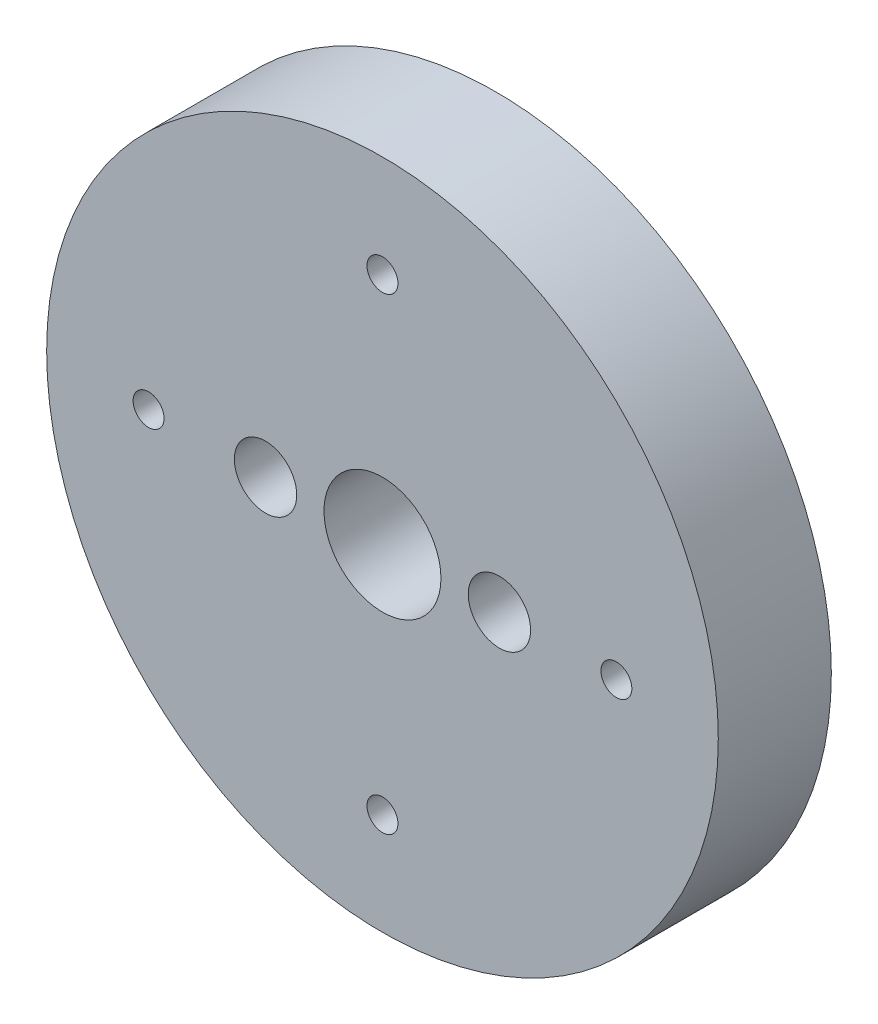
ISO-10303-21;
HEADER;
FILE_DESCRIPTION(('STEP AP214'),'2;1');
FILE_NAME('part.step','',(''),(''),'','','');
FILE_SCHEMA(('AUTOMOTIVE_DESIGN { 1 0 10303 214 1 1 1 1 }'));
ENDSEC;
DATA;
#1=APPLICATION_CONTEXT('core data for automotive mechanical design processes');
#2=APPLICATION_PROTOCOL_DEFINITION('international standard','automotive_design',2000,#1);
#3=PRODUCT_CONTEXT('',#1,'mechanical');
#4=PRODUCT('Part','Part','',(#3));
#5=PRODUCT_RELATED_PRODUCT_CATEGORY('part','',(#4));
#6=PRODUCT_DEFINITION_FORMATION('','',#4);
#7=PRODUCT_DEFINITION_CONTEXT('part definition',#1,'design');
#8=PRODUCT_DEFINITION('design','',#6,#7);
#9=PRODUCT_DEFINITION_SHAPE('','',#8);
#10=(LENGTH_UNIT() NAMED_UNIT(*) SI_UNIT(.MILLI.,.METRE.));
#11=(NAMED_UNIT(*) PLANE_ANGLE_UNIT() SI_UNIT($,.RADIAN.));
#12=(NAMED_UNIT(*) SI_UNIT($,.STERADIAN.) SOLID_ANGLE_UNIT());
#13=UNCERTAINTY_MEASURE_WITH_UNIT(LENGTH_MEASURE(1.E-05),#10,'distance_accuracy_value','');
#14=(GEOMETRIC_REPRESENTATION_CONTEXT(3) GLOBAL_UNCERTAINTY_ASSIGNED_CONTEXT((#13)) GLOBAL_UNIT_ASSIGNED_CONTEXT((#10,
#11,#12)) REPRESENTATION_CONTEXT('',''));
#15=CARTESIAN_POINT('',(0.,0.,0.));
#16=DIRECTION('',(0.,0.,1.));
#17=DIRECTION('',(1.,0.,0.));
#18=AXIS2_PLACEMENT_3D('',#15,#16,#17);
#19=CARTESIAN_POINT('',(0.,0.,5.8));
#20=DIRECTION('',(0.,0.,1.));
#21=DIRECTION('',(1.,0.,0.));
#22=AXIS2_PLACEMENT_3D('',#19,#20,#21);
#23=PLANE('',#22);
#24=CARTESIAN_POINT('',(-6.,0.,5.8));
#25=DIRECTION('',(0.,0.,1.));
#26=DIRECTION('',(1.,0.,0.));
#27=AXIS2_PLACEMENT_3D('',#24,#25,#26);
#28=CIRCLE('',#27,1.59999999999999);
#29=CARTESIAN_POINT('',(-4.40000000000001,0.,5.8));
#30=VERTEX_POINT('',#29);
#31=EDGE_CURVE('E63',#30,#30,#28,.T.);
#32=ORIENTED_EDGE('',*,*,#31,.F.);
#33=EDGE_LOOP('',(#32));
#34=FACE_BOUND('',#33,.T.);
#35=CARTESIAN_POINT('',(6.,0.,5.8));
#36=DIRECTION('',(0.,0.,1.));
#37=DIRECTION('',(1.,0.,0.));
#38=AXIS2_PLACEMENT_3D('',#35,#36,#37);
#39=CIRCLE('',#38,1.59999999999999);
#40=CARTESIAN_POINT('',(7.59999999999999,0.,5.8));
#41=VERTEX_POINT('',#40);
#42=EDGE_CURVE('E52',#41,#41,#39,.T.);
#43=ORIENTED_EDGE('',*,*,#42,.F.);
#44=EDGE_LOOP('',(#43));
#45=FACE_BOUND('',#44,.T.);
#46=CARTESIAN_POINT('',(-12.,0.,5.8));
#47=DIRECTION('',(0.,0.,1.));
#48=DIRECTION('',(1.,0.,0.));
#49=AXIS2_PLACEMENT_3D('',#46,#47,#48);
#50=CIRCLE('',#49,0.793749999999999);
#51=CARTESIAN_POINT('',(-11.20625,0.,5.8));
#52=VERTEX_POINT('',#51);
#53=EDGE_CURVE('E51',#52,#52,#50,.T.);
#54=ORIENTED_EDGE('',*,*,#53,.F.);
#55=EDGE_LOOP('',(#54));
#56=FACE_BOUND('',#55,.T.);
#57=CARTESIAN_POINT('',(0.,-12.,5.8));
#58=DIRECTION('',(0.,0.,1.));
#59=DIRECTION('',(1.,0.,0.));
#60=AXIS2_PLACEMENT_3D('',#57,#58,#59);
#61=CIRCLE('',#60,0.793749999999999);
#62=CARTESIAN_POINT('',(0.793750000000001,-12.,5.8));
#63=VERTEX_POINT('',#62);
#64=EDGE_CURVE('E67',#63,#63,#61,.T.);
#65=ORIENTED_EDGE('',*,*,#64,.F.);
#66=EDGE_LOOP('',(#65));
#67=FACE_BOUND('',#66,.T.);
#68=CARTESIAN_POINT('',(12.,0.,5.8));
#69=DIRECTION('',(0.,0.,1.));
#70=DIRECTION('',(1.,0.,0.));
#71=AXIS2_PLACEMENT_3D('',#68,#69,#70);
#72=CIRCLE('',#71,0.793749999999999);
#73=CARTESIAN_POINT('',(12.79375,0.,5.8));
#74=VERTEX_POINT('',#73);
#75=EDGE_CURVE('E72',#74,#74,#72,.T.);
#76=ORIENTED_EDGE('',*,*,#75,.F.);
#77=EDGE_LOOP('',(#76));
#78=FACE_BOUND('',#77,.T.);
#79=CARTESIAN_POINT('',(0.,12.,5.8));
#80=DIRECTION('',(0.,0.,1.));
#81=DIRECTION('',(1.,0.,0.));
#82=AXIS2_PLACEMENT_3D('',#79,#80,#81);
#83=CIRCLE('',#82,0.79375);
#84=CARTESIAN_POINT('',(0.79375,12.,5.8));
#85=VERTEX_POINT('',#84);
#86=EDGE_CURVE('E78',#85,#85,#83,.T.);
#87=ORIENTED_EDGE('',*,*,#86,.F.);
#88=EDGE_LOOP('',(#87));
#89=FACE_BOUND('',#88,.T.);
#90=CARTESIAN_POINT('',(0.,0.,5.8));
#91=DIRECTION('',(0.,0.,1.));
#92=DIRECTION('',(1.,0.,0.));
#93=AXIS2_PLACEMENT_3D('',#90,#91,#92);
#94=CIRCLE('',#93,17.2291666666667);
#95=CARTESIAN_POINT('',(17.2291666666667,0.,5.8));
#96=VERTEX_POINT('',#95);
#97=EDGE_CURVE('E10',#96,#96,#94,.T.);
#98=ORIENTED_EDGE('',*,*,#97,.T.);
#99=EDGE_LOOP('',(#98));
#100=FACE_BOUND('',#99,.T.);
#101=CARTESIAN_POINT('',(0.,0.,5.8));
#102=DIRECTION('',(0.,0.,1.));
#103=DIRECTION('',(1.,0.,0.));
#104=AXIS2_PLACEMENT_3D('',#101,#102,#103);
#105=CIRCLE('',#104,3.);
#106=CARTESIAN_POINT('',(3.,0.,5.8));
#107=VERTEX_POINT('',#106);
#108=EDGE_CURVE('E44',#107,#107,#105,.T.);
#109=ORIENTED_EDGE('',*,*,#108,.F.);
#110=EDGE_LOOP('',(#109));
#111=FACE_BOUND('',#110,.T.);
#112=ADVANCED_FACE('F31',(#34,#45,#56,#67,#78,#89,#100,#111),#23,.T.);
#113=CARTESIAN_POINT('',(0.,0.,0.));
#114=DIRECTION('',(0.,0.,1.));
#115=DIRECTION('',(1.,0.,0.));
#116=AXIS2_PLACEMENT_3D('',#113,#114,#115);
#117=PLANE('',#116);
#118=CARTESIAN_POINT('',(-6.,0.,0.));
#119=DIRECTION('',(0.,0.,1.));
#120=DIRECTION('',(1.,0.,0.));
#121=AXIS2_PLACEMENT_3D('',#118,#119,#120);
#122=CIRCLE('',#121,1.59999999999999);
#123=CARTESIAN_POINT('',(-4.40000000000001,0.,0.));
#124=VERTEX_POINT('',#123);
#125=EDGE_CURVE('E35',#124,#124,#122,.T.);
#126=ORIENTED_EDGE('',*,*,#125,.T.);
#127=EDGE_LOOP('',(#126));
#128=FACE_BOUND('',#127,.T.);
#129=CARTESIAN_POINT('',(6.,0.,0.));
#130=DIRECTION('',(0.,0.,1.));
#131=DIRECTION('',(1.,0.,0.));
#132=AXIS2_PLACEMENT_3D('',#129,#130,#131);
#133=CIRCLE('',#132,1.59999999999999);
#134=CARTESIAN_POINT('',(7.59999999999999,0.,0.));
#135=VERTEX_POINT('',#134);
#136=EDGE_CURVE('E49',#135,#135,#133,.T.);
#137=ORIENTED_EDGE('',*,*,#136,.T.);
#138=EDGE_LOOP('',(#137));
#139=FACE_BOUND('',#138,.T.);
#140=CARTESIAN_POINT('',(-12.,0.,0.));
#141=DIRECTION('',(0.,0.,1.));
#142=DIRECTION('',(1.,0.,0.));
#143=AXIS2_PLACEMENT_3D('',#140,#141,#142);
#144=CIRCLE('',#143,0.793749999999999);
#145=CARTESIAN_POINT('',(-11.20625,0.,0.));
#146=VERTEX_POINT('',#145);
#147=EDGE_CURVE('E56',#146,#146,#144,.T.);
#148=ORIENTED_EDGE('',*,*,#147,.T.);
#149=EDGE_LOOP('',(#148));
#150=FACE_BOUND('',#149,.T.);
#151=CARTESIAN_POINT('',(0.,-12.,0.));
#152=DIRECTION('',(0.,0.,1.));
#153=DIRECTION('',(1.,0.,0.));
#154=AXIS2_PLACEMENT_3D('',#151,#152,#153);
#155=CIRCLE('',#154,0.793749999999999);
#156=CARTESIAN_POINT('',(0.793750000000001,-12.,0.));
#157=VERTEX_POINT('',#156);
#158=EDGE_CURVE('E69',#157,#157,#155,.T.);
#159=ORIENTED_EDGE('',*,*,#158,.T.);
#160=EDGE_LOOP('',(#159));
#161=FACE_BOUND('',#160,.T.);
#162=CARTESIAN_POINT('',(12.,0.,0.));
#163=DIRECTION('',(0.,0.,1.));
#164=DIRECTION('',(1.,0.,0.));
#165=AXIS2_PLACEMENT_3D('',#162,#163,#164);
#166=CIRCLE('',#165,0.793749999999999);
#167=CARTESIAN_POINT('',(12.79375,0.,0.));
#168=VERTEX_POINT('',#167);
#169=EDGE_CURVE('E75',#168,#168,#166,.T.);
#170=ORIENTED_EDGE('',*,*,#169,.T.);
#171=EDGE_LOOP('',(#170));
#172=FACE_BOUND('',#171,.T.);
#173=CARTESIAN_POINT('',(0.,12.,0.));
#174=DIRECTION('',(0.,0.,1.));
#175=DIRECTION('',(1.,0.,0.));
#176=AXIS2_PLACEMENT_3D('',#173,#174,#175);
#177=CIRCLE('',#176,0.79375);
#178=CARTESIAN_POINT('',(0.79375,12.,0.));
#179=VERTEX_POINT('',#178);
#180=EDGE_CURVE('E81',#179,#179,#177,.T.);
#181=ORIENTED_EDGE('',*,*,#180,.T.);
#182=EDGE_LOOP('',(#181));
#183=FACE_BOUND('',#182,.T.);
#184=CARTESIAN_POINT('',(0.,0.,0.));
#185=DIRECTION('',(0.,0.,1.));
#186=DIRECTION('',(1.,0.,0.));
#187=AXIS2_PLACEMENT_3D('',#184,#185,#186);
#188=CIRCLE('',#187,17.2291666666667);
#189=CARTESIAN_POINT('',(17.2291666666667,0.,0.));
#190=VERTEX_POINT('',#189);
#191=EDGE_CURVE('E39',#190,#190,#188,.T.);
#192=ORIENTED_EDGE('',*,*,#191,.F.);
#193=EDGE_LOOP('',(#192));
#194=FACE_BOUND('',#193,.T.);
#195=CARTESIAN_POINT('',(0.,0.,0.));
#196=DIRECTION('',(0.,0.,1.));
#197=DIRECTION('',(1.,0.,0.));
#198=AXIS2_PLACEMENT_3D('',#195,#196,#197);
#199=CIRCLE('',#198,3.);
#200=CARTESIAN_POINT('',(3.,0.,0.));
#201=VERTEX_POINT('',#200);
#202=EDGE_CURVE('E47',#201,#201,#199,.T.);
#203=ORIENTED_EDGE('',*,*,#202,.T.);
#204=EDGE_LOOP('',(#203));
#205=FACE_BOUND('',#204,.T.);
#206=ADVANCED_FACE('F91',(#128,#139,#150,#161,#172,#183,#194,#205),#117,.F.);
#207=CARTESIAN_POINT('',(0.,0.,5.8));
#208=DIRECTION('',(0.,0.,-1.));
#209=DIRECTION('',(-1.,0.,0.));
#210=AXIS2_PLACEMENT_3D('',#207,#208,#209);
#211=CYLINDRICAL_SURFACE('',#210,17.2291666666667);
#212=ORIENTED_EDGE('',*,*,#97,.F.);
#213=EDGE_LOOP('',(#212));
#214=FACE_BOUND('',#213,.T.);
#215=ORIENTED_EDGE('',*,*,#191,.T.);
#216=EDGE_LOOP('',(#215));
#217=FACE_BOUND('',#216,.T.);
#218=ADVANCED_FACE('F33',(#214,#217),#211,.T.);
#219=CARTESIAN_POINT('',(0.,0.,5.8));
#220=DIRECTION('',(0.,0.,-1.));
#221=DIRECTION('',(-1.,0.,0.));
#222=AXIS2_PLACEMENT_3D('',#219,#220,#221);
#223=CYLINDRICAL_SURFACE('',#222,3.);
#224=ORIENTED_EDGE('',*,*,#108,.T.);
#225=EDGE_LOOP('',(#224));
#226=FACE_BOUND('',#225,.T.);
#227=ORIENTED_EDGE('',*,*,#202,.F.);
#228=EDGE_LOOP('',(#227));
#229=FACE_BOUND('',#228,.T.);
#230=ADVANCED_FACE('F93',(#226,#229),#223,.F.);
#231=CARTESIAN_POINT('',(0.,12.,0.));
#232=DIRECTION('',(0.,0.,1.));
#233=DIRECTION('',(1.,0.,0.));
#234=AXIS2_PLACEMENT_3D('',#231,#232,#233);
#235=CYLINDRICAL_SURFACE('',#234,0.79375);
#236=ORIENTED_EDGE('',*,*,#180,.F.);
#237=EDGE_LOOP('',(#236));
#238=FACE_BOUND('',#237,.T.);
#239=ORIENTED_EDGE('',*,*,#86,.T.);
#240=EDGE_LOOP('',(#239));
#241=FACE_BOUND('',#240,.T.);
#242=ADVANCED_FACE('F95',(#238,#241),#235,.F.);
#243=CARTESIAN_POINT('',(12.,0.,0.));
#244=DIRECTION('',(0.,0.,1.));
#245=DIRECTION('',(1.,0.,0.));
#246=AXIS2_PLACEMENT_3D('',#243,#244,#245);
#247=CYLINDRICAL_SURFACE('',#246,0.793749999999999);
#248=ORIENTED_EDGE('',*,*,#169,.F.);
#249=EDGE_LOOP('',(#248));
#250=FACE_BOUND('',#249,.T.);
#251=ORIENTED_EDGE('',*,*,#75,.T.);
#252=EDGE_LOOP('',(#251));
#253=FACE_BOUND('',#252,.T.);
#254=ADVANCED_FACE('F101',(#250,#253),#247,.F.);
#255=CARTESIAN_POINT('',(0.,-12.,0.));
#256=DIRECTION('',(0.,0.,1.));
#257=DIRECTION('',(1.,0.,0.));
#258=AXIS2_PLACEMENT_3D('',#255,#256,#257);
#259=CYLINDRICAL_SURFACE('',#258,0.793749999999999);
#260=ORIENTED_EDGE('',*,*,#158,.F.);
#261=EDGE_LOOP('',(#260));
#262=FACE_BOUND('',#261,.T.);
#263=ORIENTED_EDGE('',*,*,#64,.T.);
#264=EDGE_LOOP('',(#263));
#265=FACE_BOUND('',#264,.T.);
#266=ADVANCED_FACE('F127',(#262,#265),#259,.F.);
#267=CARTESIAN_POINT('',(-12.,0.,0.));
#268=DIRECTION('',(0.,0.,1.));
#269=DIRECTION('',(1.,0.,0.));
#270=AXIS2_PLACEMENT_3D('',#267,#268,#269);
#271=CYLINDRICAL_SURFACE('',#270,0.793749999999999);
#272=ORIENTED_EDGE('',*,*,#147,.F.);
#273=EDGE_LOOP('',(#272));
#274=FACE_BOUND('',#273,.T.);
#275=ORIENTED_EDGE('',*,*,#53,.T.);
#276=EDGE_LOOP('',(#275));
#277=FACE_BOUND('',#276,.T.);
#278=ADVANCED_FACE('F133',(#274,#277),#271,.F.);
#279=CARTESIAN_POINT('',(6.,0.,5.8));
#280=DIRECTION('',(0.,0.,1.));
#281=DIRECTION('',(1.,0.,0.));
#282=AXIS2_PLACEMENT_3D('',#279,#280,#281);
#283=CYLINDRICAL_SURFACE('',#282,1.59999999999999);
#284=ORIENTED_EDGE('',*,*,#42,.T.);
#285=EDGE_LOOP('',(#284));
#286=FACE_BOUND('',#285,.T.);
#287=ORIENTED_EDGE('',*,*,#136,.F.);
#288=EDGE_LOOP('',(#287));
#289=FACE_BOUND('',#288,.T.);
#290=ADVANCED_FACE('F140',(#286,#289),#283,.F.);
#291=CARTESIAN_POINT('',(-6.,0.,5.8));
#292=DIRECTION('',(0.,0.,1.));
#293=DIRECTION('',(1.,0.,0.));
#294=AXIS2_PLACEMENT_3D('',#291,#292,#293);
#295=CYLINDRICAL_SURFACE('',#294,1.59999999999999);
#296=ORIENTED_EDGE('',*,*,#31,.T.);
#297=EDGE_LOOP('',(#296));
#298=FACE_BOUND('',#297,.T.);
#299=ORIENTED_EDGE('',*,*,#125,.F.);
#300=EDGE_LOOP('',(#299));
#301=FACE_BOUND('',#300,.T.);
#302=ADVANCED_FACE('F144',(#298,#301),#295,.F.);
#303=CLOSED_SHELL('',(#112,#206,#218,#230,#242,#254,#266,#278,#290,#302));
#304=MANIFOLD_SOLID_BREP('B2',#303);
#305=ADVANCED_BREP_SHAPE_REPRESENTATION('',(#18,#304),#14);
#306=SHAPE_DEFINITION_REPRESENTATION(#9,#305);
ENDSEC;
END-ISO-10303-21;
